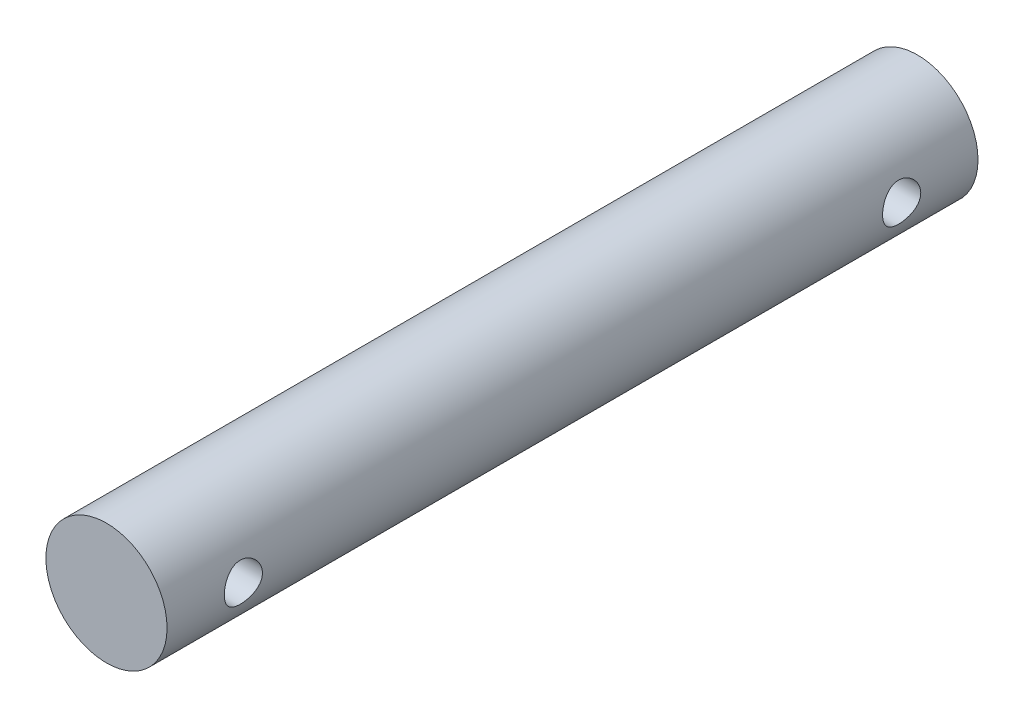
ISO-10303-21;
HEADER;
FILE_DESCRIPTION(('STEP AP214'),'2;1');
FILE_NAME('part.step','',(''),(''),'','','');
FILE_SCHEMA(('AUTOMOTIVE_DESIGN { 1 0 10303 214 1 1 1 1 }'));
ENDSEC;
DATA;
#1=APPLICATION_CONTEXT('core data for automotive mechanical design processes');
#2=APPLICATION_PROTOCOL_DEFINITION('international standard','automotive_design',2000,#1);
#3=PRODUCT_CONTEXT('',#1,'mechanical');
#4=PRODUCT('Part','Part','',(#3));
#5=PRODUCT_RELATED_PRODUCT_CATEGORY('part','',(#4));
#6=PRODUCT_DEFINITION_FORMATION('','',#4);
#7=PRODUCT_DEFINITION_CONTEXT('part definition',#1,'design');
#8=PRODUCT_DEFINITION('design','',#6,#7);
#9=PRODUCT_DEFINITION_SHAPE('','',#8);
#10=(LENGTH_UNIT() NAMED_UNIT(*) SI_UNIT(.MILLI.,.METRE.));
#11=(NAMED_UNIT(*) PLANE_ANGLE_UNIT() SI_UNIT($,.RADIAN.));
#12=(NAMED_UNIT(*) SI_UNIT($,.STERADIAN.) SOLID_ANGLE_UNIT());
#13=UNCERTAINTY_MEASURE_WITH_UNIT(LENGTH_MEASURE(1.E-05),#10,'distance_accuracy_value','');
#14=(GEOMETRIC_REPRESENTATION_CONTEXT(3) GLOBAL_UNCERTAINTY_ASSIGNED_CONTEXT((#13)) GLOBAL_UNIT_ASSIGNED_CONTEXT((#10,
#11,#12)) REPRESENTATION_CONTEXT('',''));
#15=CARTESIAN_POINT('',(0.,0.,0.));
#16=DIRECTION('',(0.,0.,1.));
#17=DIRECTION('',(1.,0.,0.));
#18=AXIS2_PLACEMENT_3D('',#15,#16,#17);
#19=CARTESIAN_POINT('',(0.,0.,85.));
#20=DIRECTION('',(0.,0.,-1.));
#21=DIRECTION('',(-1.,0.,0.));
#22=AXIS2_PLACEMENT_3D('',#19,#20,#21);
#23=CYLINDRICAL_SURFACE('',#22,6.35);
#24=CARTESIAN_POINT('',(-6.35,0.,9.99999999999999));
#25=CARTESIAN_POINT('',(-6.34999954177388,-0.109459382542908,9.9999994164505));
#26=CARTESIAN_POINT('',(-6.34714311321166,-0.218925049959983,9.99098441289842));
#27=CARTESIAN_POINT('',(-6.33602827356407,-0.434652473788956,9.9552589175087));
#28=CARTESIAN_POINT('',(-6.32776871709148,-0.540913545874183,9.92854467366542));
#29=CARTESIAN_POINT('',(-6.30674936557198,-0.747089875657803,9.85841283927101));
#30=CARTESIAN_POINT('',(-6.2939966038065,-0.847014764673544,9.8150213442808));
#31=CARTESIAN_POINT('',(-6.26530583445687,-1.03817017833074,9.712878559723));
#32=CARTESIAN_POINT('',(-6.24936730983397,-1.12939928812193,9.65412477642937));
#33=CARTESIAN_POINT('',(-6.21543683798116,-1.30343118018697,9.52098863879435));
#34=CARTESIAN_POINT('',(-6.19739963027479,-1.38592345094522,9.44621197364388));
#35=CARTESIAN_POINT('',(-6.16156531174633,-1.53742831833673,9.28399212756702));
#36=CARTESIAN_POINT('',(-6.14376824711775,-1.60643835501439,9.19654654659375));
#37=CARTESIAN_POINT('',(-6.10994220236164,-1.73071363408787,9.00877070623833));
#38=CARTESIAN_POINT('',(-6.09396900491067,-1.78558916761595,8.90817152277175));
#39=CARTESIAN_POINT('',(-6.06628083683232,-1.87751386092633,8.69858801339596));
#40=CARTESIAN_POINT('',(-6.05456472452069,-1.91456780104787,8.58960594516073));
#41=CARTESIAN_POINT('',(-6.03719105635796,-1.96865797245166,8.36985743245523));
#42=CARTESIAN_POINT('',(-6.03135942687503,-1.98627089440144,8.25924708658491));
#43=CARTESIAN_POINT('',(-6.02589838737814,-2.00278087222624,8.03649943839799));
#44=CARTESIAN_POINT('',(-6.02626729850521,-2.00168299423813,7.9243625576223));
#45=CARTESIAN_POINT('',(-6.03301213155008,-1.98125320609647,7.70653203745703));
#46=CARTESIAN_POINT('',(-6.03914580837347,-1.96265658538293,7.60076066873881));
#47=CARTESIAN_POINT('',(-6.05633519979143,-1.90895021373769,7.39392306571445));
#48=CARTESIAN_POINT('',(-6.06739144503234,-1.8738386824976,7.2928573399681));
#49=CARTESIAN_POINT('',(-6.0933643515369,-1.78758434079555,7.09655766918764));
#50=CARTESIAN_POINT('',(-6.10833567795451,-1.73621215869284,7.00143205398725));
#51=CARTESIAN_POINT('',(-6.14042705773518,-1.6190540664784,6.82091127849859));
#52=CARTESIAN_POINT('',(-6.15754767614423,-1.55326436261562,6.73551868831451));
#53=CARTESIAN_POINT('',(-6.19297824394465,-1.40553948054554,6.57273387677394));
#54=CARTESIAN_POINT('',(-6.2113065642987,-1.32299795804768,6.4958948770763));
#55=CARTESIAN_POINT('',(-6.24638917019528,-1.14597287727256,6.35701392399215));
#56=CARTESIAN_POINT('',(-6.26314333535266,-1.05148840693985,6.29497310175418));
#57=CARTESIAN_POINT('',(-6.29337063173254,-0.852181054275978,6.18706679062044));
#58=CARTESIAN_POINT('',(-6.30681635072294,-0.747281283701517,6.14133511854089));
#59=CARTESIAN_POINT('',(-6.32871380255594,-0.53075539857108,6.06833214610388));
#60=CARTESIAN_POINT('',(-6.33716707666897,-0.419131371671139,6.0410551480299));
#61=CARTESIAN_POINT('',(-6.34787832908592,-0.197020017835357,6.00668253217873));
#62=CARTESIAN_POINT('',(-6.35036604099747,-0.0866594761204078,5.9988381508384));
#63=CARTESIAN_POINT('',(-6.34954641773507,0.133813926362037,6.00143980144652));
#64=CARTESIAN_POINT('',(-6.34623994398884,0.243926821510502,6.01188311454394));
#65=CARTESIAN_POINT('',(-6.33435451969435,0.45787863778879,6.05016353853882));
#66=CARTESIAN_POINT('',(-6.325911202165,0.561805824109793,6.07755349672888));
#67=CARTESIAN_POINT('',(-6.30474229444981,0.763559126456237,6.14840255163337));
#68=CARTESIAN_POINT('',(-6.29201617296049,0.86138448373332,6.19186364211909));
#69=CARTESIAN_POINT('',(-6.26319856305455,1.05083641206033,6.29481624770412));
#70=CARTESIAN_POINT('',(-6.24703194034033,1.14225110153446,6.35467605180154));
#71=CARTESIAN_POINT('',(-6.21318025142311,1.31398832981217,6.48828611830548));
#72=CARTESIAN_POINT('',(-6.19549476796846,1.394307804701,6.56204020434403));
#73=CARTESIAN_POINT('',(-6.15970098041184,1.54493496266177,6.72486730316873));
#74=CARTESIAN_POINT('',(-6.1416043516294,1.61470885314466,6.81443781225088));
#75=CARTESIAN_POINT('',(-6.10778048462924,1.73828550034023,7.00440908318169));
#76=CARTESIAN_POINT('',(-6.09205321442616,1.79208847266323,7.10480969879696));
#77=CARTESIAN_POINT('',(-6.06492137157673,1.88186972548412,7.31340922433402));
#78=CARTESIAN_POINT('',(-6.05350088491069,1.91791378151849,7.42157763111646));
#79=CARTESIAN_POINT('',(-6.03638058511952,1.97114343438127,7.64288296304509));
#80=CARTESIAN_POINT('',(-6.03067855056365,1.98833635449891,7.75601794100063));
#81=CARTESIAN_POINT('',(-6.02587471885277,2.00284439370545,7.97845754983298));
#82=CARTESIAN_POINT('',(-6.02648176413455,2.00103634345504,8.08769940250111));
#83=CARTESIAN_POINT('',(-6.03351893966243,1.97971522185172,8.30424061257888));
#84=CARTESIAN_POINT('',(-6.03994879016139,1.96020300106662,8.41154006305545));
#85=CARTESIAN_POINT('',(-6.05770205715241,1.90461841343822,8.61955543972629));
#86=CARTESIAN_POINT('',(-6.06895005951139,1.86880073990096,8.72034634805821));
#87=CARTESIAN_POINT('',(-6.0950519726527,1.78182311987174,8.91456815637816));
#88=CARTESIAN_POINT('',(-6.10990662507357,1.7306600173762,9.00799753736861));
#89=CARTESIAN_POINT('',(-6.14228296482453,1.61207166769779,9.18885533551896));
#90=CARTESIAN_POINT('',(-6.15988705347009,1.54408200610561,9.275898871557));
#91=CARTESIAN_POINT('',(-6.19540382399595,1.39475914789555,9.43762516074985));
#92=CARTESIAN_POINT('',(-6.21331658777418,1.31342235965995,9.51230457591052));
#93=CARTESIAN_POINT('',(-6.24814930497826,1.1364502290777,9.64967858918254));
#94=CARTESIAN_POINT('',(-6.26501620684602,1.04042842012034,9.71189029117953));
#95=CARTESIAN_POINT('',(-6.29518499838427,0.838759092324701,9.8192078809382));
#96=CARTESIAN_POINT('',(-6.30848823421976,0.73311522845604,9.86432023061282));
#97=CARTESIAN_POINT('',(-6.32915110555605,0.523924084589957,9.93303881102666));
#98=CARTESIAN_POINT('',(-6.33690087757196,0.420884380962413,9.95807602276617));
#99=CARTESIAN_POINT('',(-6.34732501355995,0.211898004201455,9.99155515687942));
#100=CARTESIAN_POINT('',(-6.35000044354306,0.105951946376476,10.0000005648507));
#101=CARTESIAN_POINT('',(-6.35,0.,9.99999999999999));
#102=B_SPLINE_CURVE_WITH_KNOTS('',3,(#24,#25,#26,#27,#28,#29,#30,#31,#32,#33,#34,#35,#36,#37,
#38,#39,#40,#41,#42,#43,#44,#45,#46,#47,#48,#49,#50,#51,#52,#53,#54,#55,#56,#57,#58,#59,#60,#61,
#62,#63,#64,#65,#66,#67,#68,#69,#70,#71,#72,#73,#74,#75,#76,#77,#78,#79,#80,#81,#82,#83,#84,#85,
#86,#87,#88,#89,#90,#91,#92,#93,#94,#95,#96,#97,#98,#99,#100,#101),.UNSPECIFIED.,.T.,.F.,(4,2,2,
2,2,2,2,2,2,2,2,2,2,2,2,2,2,2,2,2,2,2,2,2,2,2,2,2,2,2,2,2,2,2,2,2,2,2,4),(0.,0.327988650558007,
0.656046852642941,0.983593805173076,1.31119396071542,1.6480406473964,1.98495123122211,
2.33034249119075,2.67564105409013,3.01039595432063,3.34506021774285,3.66626171481526,
3.98749784536771,4.31348397544876,4.63955598702786,4.9807199943601,5.32191007136131,
5.66583848283943,6.00966066096294,6.34001323425943,6.67031669785623,6.99225602053112,
7.31423529613717,7.64414085870835,7.97413734250024,8.31743010871831,8.6607182402099,
9.00272515843012,9.34459916667784,9.67076879349641,9.99692275086077,10.3181482438305,
10.6394398466999,10.9734721104888,11.3075944078494,11.6528624869261,11.9979999574323,
12.3155454971876,12.6330243200048),.UNSPECIFIED.);
#103=CARTESIAN_POINT('',(-6.35,0.,9.99999999999999));
#104=VERTEX_POINT('',#103);
#105=EDGE_CURVE('E10',#104,#104,#102,.T.);
#106=ORIENTED_EDGE('',*,*,#105,.T.);
#107=EDGE_LOOP('',(#106));
#108=FACE_BOUND('',#107,.T.);
#109=CARTESIAN_POINT('',(6.35,0.,6.));
#110=CARTESIAN_POINT('',(6.34999954177388,-0.109459382542908,6.00000058354949));
#111=CARTESIAN_POINT('',(6.34714311321166,-0.218925049959983,6.00901558710158));
#112=CARTESIAN_POINT('',(6.33602827356407,-0.434652473788956,6.0447410824913));
#113=CARTESIAN_POINT('',(6.32776871709148,-0.540913545874183,6.07145532633459));
#114=CARTESIAN_POINT('',(6.30674936557198,-0.747089875657804,6.14158716072899));
#115=CARTESIAN_POINT('',(6.2939966038065,-0.847014764673545,6.1849786557192));
#116=CARTESIAN_POINT('',(6.26530583445687,-1.03817017833074,6.287121440277));
#117=CARTESIAN_POINT('',(6.24936730983396,-1.12939928812193,6.34587522357063));
#118=CARTESIAN_POINT('',(6.21543683798116,-1.30343118018697,6.47901136120565));
#119=CARTESIAN_POINT('',(6.19739963027479,-1.38592345094522,6.55378802635612));
#120=CARTESIAN_POINT('',(6.16156531174633,-1.53742831833673,6.71600787243298));
#121=CARTESIAN_POINT('',(6.14376824711775,-1.60643835501439,6.80345345340625));
#122=CARTESIAN_POINT('',(6.10994220236164,-1.73071363408787,6.99122929376167));
#123=CARTESIAN_POINT('',(6.09396900491067,-1.78558916761595,7.09182847722825));
#124=CARTESIAN_POINT('',(6.06628083683232,-1.87751386092633,7.30141198660405));
#125=CARTESIAN_POINT('',(6.05456472452069,-1.91456780104787,7.41039405483927));
#126=CARTESIAN_POINT('',(6.03719105635796,-1.96865797245166,7.63014256754477));
#127=CARTESIAN_POINT('',(6.03135942687503,-1.98627089440144,7.74075291341509));
#128=CARTESIAN_POINT('',(6.02589838737814,-2.00278087222624,7.96350056160201));
#129=CARTESIAN_POINT('',(6.02626729850521,-2.00168299423813,8.0756374423777));
#130=CARTESIAN_POINT('',(6.03301213155008,-1.98125320609647,8.29346796254297));
#131=CARTESIAN_POINT('',(6.03914580837346,-1.96265658538293,8.39923933126119));
#132=CARTESIAN_POINT('',(6.05633519979143,-1.90895021373769,8.60607693428555));
#133=CARTESIAN_POINT('',(6.06739144503233,-1.8738386824976,8.7071426600319));
#134=CARTESIAN_POINT('',(6.0933643515369,-1.78758434079555,8.90344233081236));
#135=CARTESIAN_POINT('',(6.1083356779545,-1.73621215869284,8.99856794601275));
#136=CARTESIAN_POINT('',(6.14042705773518,-1.6190540664784,9.17908872150141));
#137=CARTESIAN_POINT('',(6.15754767614423,-1.55326436261562,9.26448131168549));
#138=CARTESIAN_POINT('',(6.19297824394465,-1.40553948054554,9.42726612322606));
#139=CARTESIAN_POINT('',(6.2113065642987,-1.32299795804768,9.5041051229237));
#140=CARTESIAN_POINT('',(6.24638917019528,-1.14597287727256,9.64298607600785));
#141=CARTESIAN_POINT('',(6.26314333535266,-1.05148840693984,9.70502689824582));
#142=CARTESIAN_POINT('',(6.29337063173254,-0.852181054275977,9.81293320937956));
#143=CARTESIAN_POINT('',(6.30681635072294,-0.747281283701516,9.85866488145911));
#144=CARTESIAN_POINT('',(6.32871380255594,-0.53075539857108,9.93166785389612));
#145=CARTESIAN_POINT('',(6.33716707666898,-0.419131371671139,9.9589448519701));
#146=CARTESIAN_POINT('',(6.34787832908592,-0.197020017835357,9.99331746782127));
#147=CARTESIAN_POINT('',(6.35036604099747,-0.086659476120407,10.0011618491616));
#148=CARTESIAN_POINT('',(6.34954641773507,0.133813926362038,9.99856019855348));
#149=CARTESIAN_POINT('',(6.34623994398884,0.243926821510503,9.98811688545606));
#150=CARTESIAN_POINT('',(6.33435451969435,0.45787863778879,9.94983646146118));
#151=CARTESIAN_POINT('',(6.325911202165,0.561805824109793,9.92244650327112));
#152=CARTESIAN_POINT('',(6.30474229444981,0.763559126456237,9.85159744836663));
#153=CARTESIAN_POINT('',(6.29201617296049,0.86138448373332,9.80813635788091));
#154=CARTESIAN_POINT('',(6.26319856305455,1.05083641206033,9.70518375229588));
#155=CARTESIAN_POINT('',(6.24703194034033,1.14225110153446,9.64532394819846));
#156=CARTESIAN_POINT('',(6.21318025142311,1.31398832981217,9.51171388169452));
#157=CARTESIAN_POINT('',(6.19549476796846,1.394307804701,9.43795979565597));
#158=CARTESIAN_POINT('',(6.15970098041184,1.54493496266177,9.27513269683127));
#159=CARTESIAN_POINT('',(6.1416043516294,1.61470885314466,9.18556218774912));
#160=CARTESIAN_POINT('',(6.10778048462924,1.73828550034023,8.99559091681831));
#161=CARTESIAN_POINT('',(6.09205321442616,1.79208847266323,8.89519030120304));
#162=CARTESIAN_POINT('',(6.06492137157673,1.88186972548412,8.68659077566598));
#163=CARTESIAN_POINT('',(6.05350088491069,1.91791378151849,8.57842236888354));
#164=CARTESIAN_POINT('',(6.03638058511952,1.97114343438127,8.35711703695492));
#165=CARTESIAN_POINT('',(6.03067855056365,1.98833635449891,8.24398205899937));
#166=CARTESIAN_POINT('',(6.02587471885277,2.00284439370545,8.02154245016702));
#167=CARTESIAN_POINT('',(6.02648176413455,2.00103634345504,7.91230059749889));
#168=CARTESIAN_POINT('',(6.03351893966243,1.97971522185172,7.69575938742112));
#169=CARTESIAN_POINT('',(6.03994879016139,1.96020300106662,7.58845993694455));
#170=CARTESIAN_POINT('',(6.05770205715241,1.90461841343822,7.38044456027371));
#171=CARTESIAN_POINT('',(6.06895005951139,1.86880073990096,7.27965365194179));
#172=CARTESIAN_POINT('',(6.0950519726527,1.78182311987174,7.08543184362183));
#173=CARTESIAN_POINT('',(6.10990662507357,1.7306600173762,6.99200246263139));
#174=CARTESIAN_POINT('',(6.14228296482453,1.61207166769779,6.81114466448104));
#175=CARTESIAN_POINT('',(6.15988705347009,1.54408200610561,6.724101128443));
#176=CARTESIAN_POINT('',(6.19540382399595,1.39475914789555,6.56237483925015));
#177=CARTESIAN_POINT('',(6.21331658777418,1.31342235965995,6.48769542408948));
#178=CARTESIAN_POINT('',(6.24814930497826,1.1364502290777,6.35032141081745));
#179=CARTESIAN_POINT('',(6.26501620684602,1.04042842012034,6.28810970882047));
#180=CARTESIAN_POINT('',(6.29518499838427,0.8387590923247,6.1807921190618));
#181=CARTESIAN_POINT('',(6.30848823421976,0.733115228456039,6.13567976938717));
#182=CARTESIAN_POINT('',(6.32915110555605,0.523924084589955,6.06696118897334));
#183=CARTESIAN_POINT('',(6.33690087757196,0.42088438096241,6.04192397723383));
#184=CARTESIAN_POINT('',(6.34732501355995,0.211898004201452,6.00844484312058));
#185=CARTESIAN_POINT('',(6.35000044354306,0.105951946376474,5.99999943514934));
#186=CARTESIAN_POINT('',(6.35,0.,6.));
#187=B_SPLINE_CURVE_WITH_KNOTS('',3,(#109,#110,#111,#112,#113,#114,#115,#116,#117,#118,#119,
#120,#121,#122,#123,#124,#125,#126,#127,#128,#129,#130,#131,#132,#133,#134,#135,#136,#137,#138,
#139,#140,#141,#142,#143,#144,#145,#146,#147,#148,#149,#150,#151,#152,#153,#154,#155,#156,#157,
#158,#159,#160,#161,#162,#163,#164,#165,#166,#167,#168,#169,#170,#171,#172,#173,#174,#175,#176,
#177,#178,#179,#180,#181,#182,#183,#184,#185,#186),.UNSPECIFIED.,.T.,.F.,(4,2,2,2,2,2,2,2,2,2,2,
2,2,2,2,2,2,2,2,2,2,2,2,2,2,2,2,2,2,2,2,2,2,2,2,2,2,2,4),(0.,0.327988650558007,
0.656046852642941,0.983593805173076,1.31119396071542,1.6480406473964,1.98495123122211,
2.33034249119075,2.67564105409013,3.01039595432063,3.34506021774285,3.66626171481525,
3.98749784536771,4.31348397544876,4.63955598702786,4.9807199943601,5.32191007136131,
5.66583848283943,6.00966066096294,6.34001323425943,6.67031669785623,6.99225602053112,
7.31423529613717,7.64414085870835,7.97413734250024,8.31743010871831,8.6607182402099,
9.00272515843012,9.34459916667784,9.67076879349641,9.99692275086076,10.3181482438305,
10.6394398466999,10.9734721104888,11.3075944078494,11.6528624869261,11.9979999574323,
12.3155454971876,12.6330243200048),.UNSPECIFIED.);
#188=CARTESIAN_POINT('',(6.35,0.,6.));
#189=VERTEX_POINT('',#188);
#190=EDGE_CURVE('E41',#189,#189,#187,.T.);
#191=ORIENTED_EDGE('',*,*,#190,.T.);
#192=EDGE_LOOP('',(#191));
#193=FACE_BOUND('',#192,.T.);
#194=CARTESIAN_POINT('',(-6.35,0.,79.));
#195=CARTESIAN_POINT('',(-6.34999954177388,-0.109459382542907,78.9999994164505));
#196=CARTESIAN_POINT('',(-6.34714311321166,-0.21892504995998,78.9909844128984));
#197=CARTESIAN_POINT('',(-6.33602827356407,-0.434652473788954,78.9552589175087));
#198=CARTESIAN_POINT('',(-6.32776871709148,-0.540913545874183,78.9285446736654));
#199=CARTESIAN_POINT('',(-6.30674936557198,-0.747089875657802,78.858412839271));
#200=CARTESIAN_POINT('',(-6.2939966038065,-0.84701476467354,78.8150213442808));
#201=CARTESIAN_POINT('',(-6.26530583445687,-1.03817017833074,78.712878559723));
#202=CARTESIAN_POINT('',(-6.24936730983396,-1.12939928812193,78.6541247764294));
#203=CARTESIAN_POINT('',(-6.21543683798116,-1.30343118018697,78.5209886387944));
#204=CARTESIAN_POINT('',(-6.19739963027479,-1.38592345094522,78.4462119736439));
#205=CARTESIAN_POINT('',(-6.16156531174633,-1.53742831833673,78.283992127567));
#206=CARTESIAN_POINT('',(-6.14376824711775,-1.60643835501439,78.1965465465938));
#207=CARTESIAN_POINT('',(-6.10994220236163,-1.73071363408787,78.0087707062384));
#208=CARTESIAN_POINT('',(-6.09396900491067,-1.78558916761595,77.9081715227718));
#209=CARTESIAN_POINT('',(-6.06628083683232,-1.87751386092633,77.698588013396));
#210=CARTESIAN_POINT('',(-6.05456472452069,-1.91456780104787,77.5896059451607));
#211=CARTESIAN_POINT('',(-6.03719105635796,-1.96865797245167,77.3698574324553));
#212=CARTESIAN_POINT('',(-6.03135942687503,-1.98627089440144,77.2592470865849));
#213=CARTESIAN_POINT('',(-6.02589838737814,-2.00278087222625,77.036499438398));
#214=CARTESIAN_POINT('',(-6.02626729850521,-2.00168299423814,76.9243625576223));
#215=CARTESIAN_POINT('',(-6.03301213155008,-1.98125320609647,76.7065320374571));
#216=CARTESIAN_POINT('',(-6.03914580837346,-1.96265658538293,76.6007606687388));
#217=CARTESIAN_POINT('',(-6.05633519979143,-1.9089502137377,76.3939230657145));
#218=CARTESIAN_POINT('',(-6.06739144503233,-1.87383868249761,76.2928573399681));
#219=CARTESIAN_POINT('',(-6.0933643515369,-1.78758434079556,76.0965576691877));
#220=CARTESIAN_POINT('',(-6.1083356779545,-1.73621215869284,76.0014320539873));
#221=CARTESIAN_POINT('',(-6.14042705773518,-1.61905406647841,75.8209112784986));
#222=CARTESIAN_POINT('',(-6.15754767614423,-1.55326436261563,75.7355186883145));
#223=CARTESIAN_POINT('',(-6.19297824394465,-1.40553948054555,75.572733876774));
#224=CARTESIAN_POINT('',(-6.2113065642987,-1.3229979580477,75.4958948770763));
#225=CARTESIAN_POINT('',(-6.24638917019528,-1.14597287727257,75.3570139239922));
#226=CARTESIAN_POINT('',(-6.26314333535266,-1.05148840693986,75.2949731017542));
#227=CARTESIAN_POINT('',(-6.29337063173253,-0.852181054275999,75.1870667906205));
#228=CARTESIAN_POINT('',(-6.30681635072294,-0.747281283701536,75.1413351185409));
#229=CARTESIAN_POINT('',(-6.32871380255594,-0.530755398571097,75.0683321461039));
#230=CARTESIAN_POINT('',(-6.33716707666897,-0.419131371671154,75.0410551480299));
#231=CARTESIAN_POINT('',(-6.34787832908592,-0.197020017835372,75.0066825321787));
#232=CARTESIAN_POINT('',(-6.35036604099747,-0.0866594761204227,74.9988381508384));
#233=CARTESIAN_POINT('',(-6.34954641773508,0.133813926362021,75.0014398014465));
#234=CARTESIAN_POINT('',(-6.34623994398884,0.243926821510485,75.011883114544));
#235=CARTESIAN_POINT('',(-6.33435451969436,0.457878637788772,75.0501635385388));
#236=CARTESIAN_POINT('',(-6.325911202165,0.561805824109776,75.0775534967289));
#237=CARTESIAN_POINT('',(-6.30474229444981,0.763559126456219,75.1484025516334));
#238=CARTESIAN_POINT('',(-6.29201617296049,0.861384483733302,75.1918636421191));
#239=CARTESIAN_POINT('',(-6.26319856305455,1.05083641206031,75.2948162477041));
#240=CARTESIAN_POINT('',(-6.24703194034034,1.14225110153444,75.3546760518015));
#241=CARTESIAN_POINT('',(-6.21318025142312,1.31398832981215,75.4882861183055));
#242=CARTESIAN_POINT('',(-6.19549476796847,1.39430780470098,75.562040204344));
#243=CARTESIAN_POINT('',(-6.15970098041184,1.54493496266175,75.7248673031687));
#244=CARTESIAN_POINT('',(-6.1416043516294,1.61470885314465,75.8144378122509));
#245=CARTESIAN_POINT('',(-6.10778048462925,1.73828550034021,76.0044090831817));
#246=CARTESIAN_POINT('',(-6.09205321442617,1.79208847266322,76.104809698797));
#247=CARTESIAN_POINT('',(-6.06492137157674,1.88186972548411,76.313409224334));
#248=CARTESIAN_POINT('',(-6.05350088491069,1.91791378151848,76.4215776311165));
#249=CARTESIAN_POINT('',(-6.03638058511952,1.97114343438126,76.6428829630451));
#250=CARTESIAN_POINT('',(-6.03067855056365,1.9883363544989,76.7560179410006));
#251=CARTESIAN_POINT('',(-6.02587471885277,2.00284439370544,76.978457549833));
#252=CARTESIAN_POINT('',(-6.02648176413455,2.00103634345502,77.0876994025011));
#253=CARTESIAN_POINT('',(-6.03351893966243,1.97971522185171,77.3042406125789));
#254=CARTESIAN_POINT('',(-6.0399487901614,1.96020300106661,77.4115400630555));
#255=CARTESIAN_POINT('',(-6.05770205715241,1.90461841343821,77.6195554397263));
#256=CARTESIAN_POINT('',(-6.06895005951139,1.86880073990096,77.7203463480582));
#257=CARTESIAN_POINT('',(-6.0950519726527,1.78182311987173,77.9145681563782));
#258=CARTESIAN_POINT('',(-6.10990662507357,1.7306600173762,78.0079975373686));
#259=CARTESIAN_POINT('',(-6.14228296482453,1.61207166769778,78.188855335519));
#260=CARTESIAN_POINT('',(-6.15988705347009,1.5440820061056,78.275898871557));
#261=CARTESIAN_POINT('',(-6.19540382399596,1.39475914789554,78.4376251607499));
#262=CARTESIAN_POINT('',(-6.21331658777418,1.31342235965994,78.5123045759105));
#263=CARTESIAN_POINT('',(-6.24814930497826,1.1364502290777,78.6496785891826));
#264=CARTESIAN_POINT('',(-6.26501620684602,1.04042842012034,78.7118902911795));
#265=CARTESIAN_POINT('',(-6.29518499838427,0.838759092324695,78.8192078809382));
#266=CARTESIAN_POINT('',(-6.30848823421977,0.733115228456032,78.8643202306128));
#267=CARTESIAN_POINT('',(-6.32915110555605,0.523924084589949,78.9330388110267));
#268=CARTESIAN_POINT('',(-6.33690087757196,0.420884380962406,78.9580760227662));
#269=CARTESIAN_POINT('',(-6.34732501355995,0.21189800420145,78.9915551568794));
#270=CARTESIAN_POINT('',(-6.35000044354306,0.105951946376474,79.0000005648507));
#271=CARTESIAN_POINT('',(-6.35,0.,79.));
#272=B_SPLINE_CURVE_WITH_KNOTS('',3,(#194,#195,#196,#197,#198,#199,#200,#201,#202,#203,#204,
#205,#206,#207,#208,#209,#210,#211,#212,#213,#214,#215,#216,#217,#218,#219,#220,#221,#222,#223,
#224,#225,#226,#227,#228,#229,#230,#231,#232,#233,#234,#235,#236,#237,#238,#239,#240,#241,#242,
#243,#244,#245,#246,#247,#248,#249,#250,#251,#252,#253,#254,#255,#256,#257,#258,#259,#260,#261,
#262,#263,#264,#265,#266,#267,#268,#269,#270,#271),.UNSPECIFIED.,.T.,.F.,(4,2,2,2,2,2,2,2,2,2,2,
2,2,2,2,2,2,2,2,2,2,2,2,2,2,2,2,2,2,2,2,2,2,2,2,2,2,2,4),(0.,0.327988650558006,
0.656046852642941,0.983593805173072,1.31119396071542,1.6480406473964,1.98495123122211,
2.33034249119075,2.67564105409012,3.01039595432062,3.34506021774283,3.66626171481526,
3.98749784536772,4.31348397544875,4.63955598702785,4.98071999436009,5.32191007136129,
5.66583848283942,6.00966066096294,6.34001323425943,6.67031669785622,6.99225602053111,
7.31423529613716,7.64414085870834,7.97413734250023,8.31743010871832,8.66071824020989,
9.00272515843013,9.34459916667783,9.67076879349638,9.99692275086074,10.3181482438305,
10.6394398466999,10.9734721104888,11.3075944078493,11.6528624869261,11.9979999574323,
12.3155454971876,12.6330243200048),.UNSPECIFIED.);
#273=CARTESIAN_POINT('',(-6.35,0.,79.));
#274=VERTEX_POINT('',#273);
#275=EDGE_CURVE('E45',#274,#274,#272,.T.);
#276=ORIENTED_EDGE('',*,*,#275,.T.);
#277=EDGE_LOOP('',(#276));
#278=FACE_BOUND('',#277,.T.);
#279=CARTESIAN_POINT('',(6.35,0.,75.));
#280=CARTESIAN_POINT('',(6.34999954177388,-0.109459382542916,75.0000005835495));
#281=CARTESIAN_POINT('',(6.34714311321166,-0.218925049959989,75.0090155871016));
#282=CARTESIAN_POINT('',(6.33602827356407,-0.434652473788963,75.0447410824913));
#283=CARTESIAN_POINT('',(6.32776871709148,-0.540913545874191,75.0714553263346));
#284=CARTESIAN_POINT('',(6.30674936557198,-0.747089875657808,75.141587160729));
#285=CARTESIAN_POINT('',(6.2939966038065,-0.847014764673545,75.1849786557192));
#286=CARTESIAN_POINT('',(6.26530583445687,-1.03817017833074,75.287121440277));
#287=CARTESIAN_POINT('',(6.24936730983396,-1.12939928812194,75.3458752235706));
#288=CARTESIAN_POINT('',(6.21543683798116,-1.30343118018697,75.4790113612057));
#289=CARTESIAN_POINT('',(6.19739963027479,-1.38592345094522,75.5537880263561));
#290=CARTESIAN_POINT('',(6.16156531174633,-1.53742831833673,75.716007872433));
#291=CARTESIAN_POINT('',(6.14376824711775,-1.60643835501439,75.8034534534063));
#292=CARTESIAN_POINT('',(6.10994220236163,-1.73071363408787,75.9912292937617));
#293=CARTESIAN_POINT('',(6.09396900491067,-1.78558916761595,76.0918284772283));
#294=CARTESIAN_POINT('',(6.06628083683232,-1.87751386092633,76.3014119866041));
#295=CARTESIAN_POINT('',(6.05456472452069,-1.91456780104788,76.4103940548393));
#296=CARTESIAN_POINT('',(6.03719105635796,-1.96865797245167,76.6301425675448));
#297=CARTESIAN_POINT('',(6.03135942687503,-1.98627089440144,76.7407529134151));
#298=CARTESIAN_POINT('',(6.02589838737814,-2.00278087222625,76.963500561602));
#299=CARTESIAN_POINT('',(6.02626729850521,-2.00168299423814,77.0756374423777));
#300=CARTESIAN_POINT('',(6.03301213155008,-1.98125320609647,77.293467962543));
#301=CARTESIAN_POINT('',(6.03914580837346,-1.96265658538293,77.3992393312612));
#302=CARTESIAN_POINT('',(6.05633519979143,-1.9089502137377,77.6060769342856));
#303=CARTESIAN_POINT('',(6.06739144503233,-1.87383868249761,77.7071426600319));
#304=CARTESIAN_POINT('',(6.0933643515369,-1.78758434079556,77.9034423308124));
#305=CARTESIAN_POINT('',(6.1083356779545,-1.73621215869284,77.9985679460128));
#306=CARTESIAN_POINT('',(6.14042705773518,-1.61905406647841,78.1790887215014));
#307=CARTESIAN_POINT('',(6.15754767614423,-1.55326436261562,78.2644813116855));
#308=CARTESIAN_POINT('',(6.19297824394465,-1.40553948054554,78.4272661232261));
#309=CARTESIAN_POINT('',(6.2113065642987,-1.32299795804768,78.5041051229237));
#310=CARTESIAN_POINT('',(6.24638917019528,-1.14597287727256,78.6429860760079));
#311=CARTESIAN_POINT('',(6.26314333535266,-1.05148840693985,78.7050268982458));
#312=CARTESIAN_POINT('',(6.29337063173253,-0.852181054275981,78.8129332093796));
#313=CARTESIAN_POINT('',(6.30681635072294,-0.747281283701518,78.8586648814591));
#314=CARTESIAN_POINT('',(6.32871380255594,-0.530755398571086,78.9316678538961));
#315=CARTESIAN_POINT('',(6.33716707666897,-0.419131371671149,78.9589448519701));
#316=CARTESIAN_POINT('',(6.34787832908592,-0.197020017835371,78.9933174678213));
#317=CARTESIAN_POINT('',(6.35036604099747,-0.0866594761204203,79.0011618491616));
#318=CARTESIAN_POINT('',(6.34954641773508,0.133813926362025,78.9985601985535));
#319=CARTESIAN_POINT('',(6.34623994398884,0.24392682151049,78.9881168854561));
#320=CARTESIAN_POINT('',(6.33435451969435,0.457878637788778,78.9498364614612));
#321=CARTESIAN_POINT('',(6.325911202165,0.561805824109782,78.9224465032711));
#322=CARTESIAN_POINT('',(6.30474229444981,0.763559126456226,78.8515974483666));
#323=CARTESIAN_POINT('',(6.29201617296049,0.861384483733308,78.8081363578809));
#324=CARTESIAN_POINT('',(6.26319856305455,1.05083641206032,78.7051837522959));
#325=CARTESIAN_POINT('',(6.24703194034034,1.14225110153445,78.6453239481985));
#326=CARTESIAN_POINT('',(6.21318025142312,1.31398832981216,78.5117138816945));
#327=CARTESIAN_POINT('',(6.19549476796847,1.39430780470099,78.437959795656));
#328=CARTESIAN_POINT('',(6.15970098041184,1.54493496266176,78.2751326968313));
#329=CARTESIAN_POINT('',(6.1416043516294,1.61470885314465,78.1855621877491));
#330=CARTESIAN_POINT('',(6.10778048462925,1.73828550034022,77.9955909168183));
#331=CARTESIAN_POINT('',(6.09205321442616,1.79208847266322,77.895190301203));
#332=CARTESIAN_POINT('',(6.06492137157674,1.88186972548411,77.686590775666));
#333=CARTESIAN_POINT('',(6.05350088491069,1.91791378151848,77.5784223688835));
#334=CARTESIAN_POINT('',(6.03638058511952,1.97114343438126,77.3571170369549));
#335=CARTESIAN_POINT('',(6.03067855056365,1.9883363544989,77.2439820589994));
#336=CARTESIAN_POINT('',(6.02587471885277,2.00284439370544,77.021542450167));
#337=CARTESIAN_POINT('',(6.02648176413455,2.00103634345502,76.9123005974989));
#338=CARTESIAN_POINT('',(6.03351893966243,1.97971522185171,76.6957593874211));
#339=CARTESIAN_POINT('',(6.0399487901614,1.9602030010666,76.5884599369446));
#340=CARTESIAN_POINT('',(6.05770205715241,1.90461841343821,76.3804445602737));
#341=CARTESIAN_POINT('',(6.06895005951139,1.86880073990095,76.2796536519418));
#342=CARTESIAN_POINT('',(6.0950519726527,1.78182311987173,76.0854318436218));
#343=CARTESIAN_POINT('',(6.10990662507357,1.73066001737619,75.9920024626314));
#344=CARTESIAN_POINT('',(6.14228296482453,1.61207166769778,75.8111446644811));
#345=CARTESIAN_POINT('',(6.1598870534701,1.5440820061056,75.724101128443));
#346=CARTESIAN_POINT('',(6.19540382399596,1.39475914789553,75.5623748392502));
#347=CARTESIAN_POINT('',(6.21331658777418,1.31342235965993,75.4876954240895));
#348=CARTESIAN_POINT('',(6.24814930497826,1.13645022907769,75.3503214108175));
#349=CARTESIAN_POINT('',(6.26501620684602,1.04042842012033,75.2881097088205));
#350=CARTESIAN_POINT('',(6.29518499838427,0.838759092324688,75.1807921190618));
#351=CARTESIAN_POINT('',(6.30848823421977,0.733115228456027,75.1356797693872));
#352=CARTESIAN_POINT('',(6.32915110555605,0.523924084589945,75.0669611889734));
#353=CARTESIAN_POINT('',(6.33690087757196,0.420884380962401,75.0419239772338));
#354=CARTESIAN_POINT('',(6.34732501355995,0.211898004201443,75.0084448431206));
#355=CARTESIAN_POINT('',(6.35000044354306,0.105951946376466,74.9999994351493));
#356=CARTESIAN_POINT('',(6.35,0.,75.));
#357=B_SPLINE_CURVE_WITH_KNOTS('',3,(#279,#280,#281,#282,#283,#284,#285,#286,#287,#288,#289,
#290,#291,#292,#293,#294,#295,#296,#297,#298,#299,#300,#301,#302,#303,#304,#305,#306,#307,#308,
#309,#310,#311,#312,#313,#314,#315,#316,#317,#318,#319,#320,#321,#322,#323,#324,#325,#326,#327,
#328,#329,#330,#331,#332,#333,#334,#335,#336,#337,#338,#339,#340,#341,#342,#343,#344,#345,#346,
#347,#348,#349,#350,#351,#352,#353,#354,#355,#356),.UNSPECIFIED.,.T.,.F.,(4,2,2,2,2,2,2,2,2,2,2,
2,2,2,2,2,2,2,2,2,2,2,2,2,2,2,2,2,2,2,2,2,2,2,2,2,2,2,4),(0.,0.327988650558004,
0.656046852642939,0.983593805173066,1.31119396071541,1.64804064739639,1.9849512312221,
2.33034249119074,2.67564105409013,3.01039595432063,3.34506021774284,3.66626171481524,
3.98749784536771,4.31348397544875,4.63955598702786,4.98071999436009,5.3219100713613,
5.66583848283942,6.00966066096293,6.34001323425942,6.67031669785621,6.99225602053111,
7.31423529613716,7.64414085870834,7.97413734250023,8.3174301087183,8.66071824020989,
9.0027251584301,9.34459916667782,9.6707687934964,9.99692275086075,10.3181482438305,
10.6394398466999,10.9734721104888,11.3075944078493,11.6528624869261,11.9979999574323,
12.3155454971876,12.6330243200048),.UNSPECIFIED.);
#358=CARTESIAN_POINT('',(6.35,0.,75.));
#359=VERTEX_POINT('',#358);
#360=EDGE_CURVE('E49',#359,#359,#357,.T.);
#361=ORIENTED_EDGE('',*,*,#360,.T.);
#362=EDGE_LOOP('',(#361));
#363=FACE_BOUND('',#362,.T.);
#364=CARTESIAN_POINT('',(0.,0.,85.));
#365=DIRECTION('',(0.,0.,1.));
#366=DIRECTION('',(1.,0.,0.));
#367=AXIS2_PLACEMENT_3D('',#364,#365,#366);
#368=CIRCLE('',#367,6.35);
#369=CARTESIAN_POINT('',(6.35,0.,85.));
#370=VERTEX_POINT('',#369);
#371=EDGE_CURVE('E74',#370,#370,#368,.T.);
#372=ORIENTED_EDGE('',*,*,#371,.F.);
#373=EDGE_LOOP('',(#372));
#374=FACE_BOUND('',#373,.T.);
#375=CARTESIAN_POINT('',(0.,0.,0.));
#376=DIRECTION('',(0.,0.,1.));
#377=DIRECTION('',(1.,0.,0.));
#378=AXIS2_PLACEMENT_3D('',#375,#376,#377);
#379=CIRCLE('',#378,6.35);
#380=CARTESIAN_POINT('',(6.35,0.,0.));
#381=VERTEX_POINT('',#380);
#382=EDGE_CURVE('E75',#381,#381,#379,.T.);
#383=ORIENTED_EDGE('',*,*,#382,.T.);
#384=EDGE_LOOP('',(#383));
#385=FACE_BOUND('',#384,.T.);
#386=ADVANCED_FACE('F31',(#108,#193,#278,#363,#374,#385),#23,.T.);
#387=CARTESIAN_POINT('',(0.,0.,85.));
#388=DIRECTION('',(0.,0.,1.));
#389=DIRECTION('',(1.,0.,0.));
#390=AXIS2_PLACEMENT_3D('',#387,#388,#389);
#391=PLANE('',#390);
#392=ORIENTED_EDGE('',*,*,#371,.T.);
#393=EDGE_LOOP('',(#392));
#394=FACE_BOUND('',#393,.T.);
#395=ADVANCED_FACE('F68',(#394),#391,.T.);
#396=CARTESIAN_POINT('',(0.,0.,0.));
#397=DIRECTION('',(0.,0.,1.));
#398=DIRECTION('',(1.,0.,0.));
#399=AXIS2_PLACEMENT_3D('',#396,#397,#398);
#400=PLANE('',#399);
#401=ORIENTED_EDGE('',*,*,#382,.F.);
#402=EDGE_LOOP('',(#401));
#403=FACE_BOUND('',#402,.T.);
#404=ADVANCED_FACE('F66',(#403),#400,.F.);
#405=CARTESIAN_POINT('',(-6.35,0.,77.));
#406=DIRECTION('',(1.,0.,0.));
#407=DIRECTION('',(0.,0.,-1.));
#408=AXIS2_PLACEMENT_3D('',#405,#406,#407);
#409=CYLINDRICAL_SURFACE('',#408,2.);
#410=ORIENTED_EDGE('',*,*,#360,.F.);
#411=EDGE_LOOP('',(#410));
#412=FACE_BOUND('',#411,.T.);
#413=ORIENTED_EDGE('',*,*,#275,.F.);
#414=EDGE_LOOP('',(#413));
#415=FACE_BOUND('',#414,.T.);
#416=ADVANCED_FACE('F60',(#412,#415),#409,.F.);
#417=CARTESIAN_POINT('',(-6.35,0.,8.));
#418=DIRECTION('',(1.,0.,0.));
#419=DIRECTION('',(0.,0.,-1.));
#420=AXIS2_PLACEMENT_3D('',#417,#418,#419);
#421=CYLINDRICAL_SURFACE('',#420,2.);
#422=ORIENTED_EDGE('',*,*,#190,.F.);
#423=EDGE_LOOP('',(#422));
#424=FACE_BOUND('',#423,.T.);
#425=ORIENTED_EDGE('',*,*,#105,.F.);
#426=EDGE_LOOP('',(#425));
#427=FACE_BOUND('',#426,.T.);
#428=ADVANCED_FACE('F57',(#424,#427),#421,.F.);
#429=CLOSED_SHELL('',(#386,#395,#404,#416,#428));
#430=MANIFOLD_SOLID_BREP('B2',#429);
#431=ADVANCED_BREP_SHAPE_REPRESENTATION('',(#18,#430),#14);
#432=SHAPE_DEFINITION_REPRESENTATION(#9,#431);
ENDSEC;
END-ISO-10303-21;
